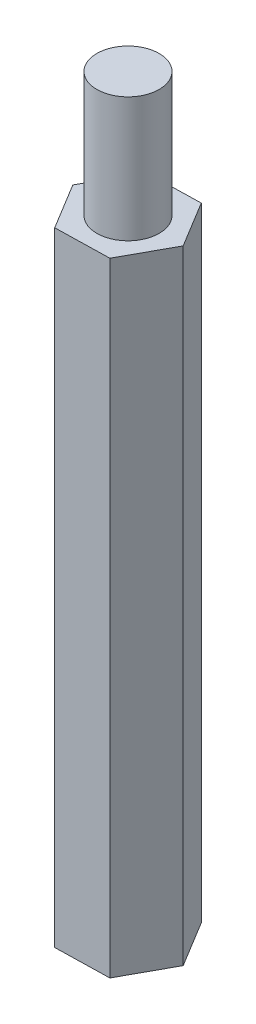
ISO-10303-21;
HEADER;
FILE_DESCRIPTION(('STEP AP214'),'2;1');
FILE_NAME('part.step','',(''),(''),'','','');
FILE_SCHEMA(('AUTOMOTIVE_DESIGN { 1 0 10303 214 1 1 1 1 }'));
ENDSEC;
DATA;
#1=APPLICATION_CONTEXT('core data for automotive mechanical design processes');
#2=APPLICATION_PROTOCOL_DEFINITION('international standard','automotive_design',2000,#1);
#3=PRODUCT_CONTEXT('',#1,'mechanical');
#4=PRODUCT('Part','Part','',(#3));
#5=PRODUCT_RELATED_PRODUCT_CATEGORY('part','',(#4));
#6=PRODUCT_DEFINITION_FORMATION('','',#4);
#7=PRODUCT_DEFINITION_CONTEXT('part definition',#1,'design');
#8=PRODUCT_DEFINITION('design','',#6,#7);
#9=PRODUCT_DEFINITION_SHAPE('','',#8);
#10=(LENGTH_UNIT() NAMED_UNIT(*) SI_UNIT(.MILLI.,.METRE.));
#11=(NAMED_UNIT(*) PLANE_ANGLE_UNIT() SI_UNIT($,.RADIAN.));
#12=(NAMED_UNIT(*) SI_UNIT($,.STERADIAN.) SOLID_ANGLE_UNIT());
#13=UNCERTAINTY_MEASURE_WITH_UNIT(LENGTH_MEASURE(1.E-05),#10,'distance_accuracy_value','');
#14=(GEOMETRIC_REPRESENTATION_CONTEXT(3) GLOBAL_UNCERTAINTY_ASSIGNED_CONTEXT((#13)) GLOBAL_UNIT_ASSIGNED_CONTEXT((#10,
#11,#12)) REPRESENTATION_CONTEXT('',''));
#15=CARTESIAN_POINT('',(0.,0.,0.));
#16=DIRECTION('',(0.,0.,1.));
#17=DIRECTION('',(1.,0.,0.));
#18=AXIS2_PLACEMENT_3D('',#15,#16,#17);
#19=CARTESIAN_POINT('',(0.,30.,0.));
#20=DIRECTION('',(0.,1.,0.));
#21=DIRECTION('',(0.,0.,1.));
#22=AXIS2_PLACEMENT_3D('',#19,#20,#21);
#23=PLANE('',#22);
#24=DIRECTION('',(-0.519215943218182,0.,-0.854643085918358));
#25=VECTOR('',#24,1.);
#26=CARTESIAN_POINT('',(2.59742823863157,30.,-0.0580219368798728));
#27=LINE('',#26,#25);
#28=CARTESIAN_POINT('',(2.59742823863157,30.,-0.0580219368798728));
#29=VERTEX_POINT('',#28);
#30=CARTESIAN_POINT('',(1.24846564800104,30.,-2.27844980760195));
#31=VERTEX_POINT('',#30);
#32=EDGE_CURVE('E134',#29,#31,#27,.T.);
#33=ORIENTED_EDGE('',*,*,#32,.T.);
#34=DIRECTION('',(-0.999750595183115,0.,0.0223326539176654));
#35=VECTOR('',#34,1.);
#36=CARTESIAN_POINT('',(1.24846564800104,30.,-2.27844980760195));
#37=LINE('',#36,#35);
#38=CARTESIAN_POINT('',(-1.34896259063053,30.,-2.22042787072207));
#39=VERTEX_POINT('',#38);
#40=EDGE_CURVE('E92',#31,#39,#37,.T.);
#41=ORIENTED_EDGE('',*,*,#40,.T.);
#42=DIRECTION('',(-0.480534651964933,0.,0.876975739836023));
#43=VECTOR('',#42,1.);
#44=CARTESIAN_POINT('',(-1.34896259063053,30.,-2.22042787072207));
#45=LINE('',#44,#43);
#46=CARTESIAN_POINT('',(-2.59742823863157,30.,0.058021936879873));
#47=VERTEX_POINT('',#46);
#48=EDGE_CURVE('E105',#39,#47,#45,.T.);
#49=ORIENTED_EDGE('',*,*,#48,.T.);
#50=DIRECTION('',(0.519215943218182,0.,0.854643085918358));
#51=VECTOR('',#50,1.);
#52=CARTESIAN_POINT('',(-2.59742823863157,30.,0.058021936879873));
#53=LINE('',#52,#51);
#54=CARTESIAN_POINT('',(-1.24846564800104,30.,2.27844980760195));
#55=VERTEX_POINT('',#54);
#56=EDGE_CURVE('E99',#47,#55,#53,.T.);
#57=ORIENTED_EDGE('',*,*,#56,.T.);
#58=DIRECTION('',(0.999750595183115,0.,-0.0223326539176651));
#59=VECTOR('',#58,1.);
#60=CARTESIAN_POINT('',(-1.24846564800104,30.,2.27844980760195));
#61=LINE('',#60,#59);
#62=CARTESIAN_POINT('',(1.34896259063053,30.,2.22042787072208));
#63=VERTEX_POINT('',#62);
#64=EDGE_CURVE('E103',#55,#63,#61,.T.);
#65=ORIENTED_EDGE('',*,*,#64,.T.);
#66=DIRECTION('',(0.480534651964934,0.,-0.876975739836023));
#67=VECTOR('',#66,1.);
#68=CARTESIAN_POINT('',(1.34896259063053,30.,2.22042787072208));
#69=LINE('',#68,#67);
#70=EDGE_CURVE('E55',#63,#29,#69,.T.);
#71=ORIENTED_EDGE('',*,*,#70,.T.);
#72=EDGE_LOOP('',(#33,#41,#49,#57,#65,#71));
#73=FACE_BOUND('',#72,.T.);
#74=CARTESIAN_POINT('',(0.,30.,0.));
#75=DIRECTION('',(0.,1.,0.));
#76=DIRECTION('',(0.,0.,1.));
#77=AXIS2_PLACEMENT_3D('',#74,#75,#76);
#78=CIRCLE('',#77,1.5);
#79=CARTESIAN_POINT('',(0.,30.,1.5));
#80=VERTEX_POINT('',#79);
#81=EDGE_CURVE('E127',#80,#80,#78,.T.);
#82=ORIENTED_EDGE('',*,*,#81,.F.);
#83=EDGE_LOOP('',(#82));
#84=FACE_BOUND('',#83,.T.);
#85=ADVANCED_FACE('F38',(#73,#84),#23,.T.);
#86=CARTESIAN_POINT('',(0.,0.,0.));
#87=DIRECTION('',(0.,1.,0.));
#88=DIRECTION('',(0.,0.,1.));
#89=AXIS2_PLACEMENT_3D('',#86,#87,#88);
#90=PLANE('',#89);
#91=CARTESIAN_POINT('',(0.,0.,0.));
#92=DIRECTION('',(0.,-1.,0.));
#93=DIRECTION('',(0.,0.,-1.));
#94=AXIS2_PLACEMENT_3D('',#91,#92,#93);
#95=CIRCLE('',#94,1.5);
#96=CARTESIAN_POINT('',(0.,0.,-1.5));
#97=VERTEX_POINT('',#96);
#98=EDGE_CURVE('E183',#97,#97,#95,.T.);
#99=ORIENTED_EDGE('',*,*,#98,.F.);
#100=EDGE_LOOP('',(#99));
#101=FACE_BOUND('',#100,.T.);
#102=DIRECTION('',(-0.519215943218182,0.,-0.854643085918358));
#103=VECTOR('',#102,1.);
#104=CARTESIAN_POINT('',(2.59742823863157,0.,-0.0580219368798728));
#105=LINE('',#104,#103);
#106=CARTESIAN_POINT('',(2.59742823863157,0.,-0.0580219368798728));
#107=VERTEX_POINT('',#106);
#108=CARTESIAN_POINT('',(1.24846564800104,0.,-2.27844980760195));
#109=VERTEX_POINT('',#108);
#110=EDGE_CURVE('E123',#107,#109,#105,.T.);
#111=ORIENTED_EDGE('',*,*,#110,.F.);
#112=DIRECTION('',(0.480534651964934,0.,-0.876975739836023));
#113=VECTOR('',#112,1.);
#114=CARTESIAN_POINT('',(1.34896259063053,0.,2.22042787072208));
#115=LINE('',#114,#113);
#116=CARTESIAN_POINT('',(1.34896259063053,0.,2.22042787072208));
#117=VERTEX_POINT('',#116);
#118=EDGE_CURVE('E84',#117,#107,#115,.T.);
#119=ORIENTED_EDGE('',*,*,#118,.F.);
#120=DIRECTION('',(0.999750595183115,0.,-0.0223326539176651));
#121=VECTOR('',#120,1.);
#122=CARTESIAN_POINT('',(-1.24846564800104,0.,2.27844980760195));
#123=LINE('',#122,#121);
#124=CARTESIAN_POINT('',(-1.24846564800104,0.,2.27844980760195));
#125=VERTEX_POINT('',#124);
#126=EDGE_CURVE('E78',#125,#117,#123,.T.);
#127=ORIENTED_EDGE('',*,*,#126,.F.);
#128=DIRECTION('',(0.519215943218182,0.,0.854643085918358));
#129=VECTOR('',#128,1.);
#130=CARTESIAN_POINT('',(-2.59742823863157,0.,0.058021936879873));
#131=LINE('',#130,#129);
#132=CARTESIAN_POINT('',(-2.59742823863157,0.,0.058021936879873));
#133=VERTEX_POINT('',#132);
#134=EDGE_CURVE('E113',#133,#125,#131,.T.);
#135=ORIENTED_EDGE('',*,*,#134,.F.);
#136=DIRECTION('',(-0.480534651964933,0.,0.876975739836023));
#137=VECTOR('',#136,1.);
#138=CARTESIAN_POINT('',(-1.34896259063053,0.,-2.22042787072207));
#139=LINE('',#138,#137);
#140=CARTESIAN_POINT('',(-1.34896259063053,0.,-2.22042787072207));
#141=VERTEX_POINT('',#140);
#142=EDGE_CURVE('E129',#141,#133,#139,.T.);
#143=ORIENTED_EDGE('',*,*,#142,.F.);
#144=DIRECTION('',(-0.999750595183115,0.,0.0223326539176654));
#145=VECTOR('',#144,1.);
#146=CARTESIAN_POINT('',(1.24846564800104,0.,-2.27844980760195));
#147=LINE('',#146,#145);
#148=EDGE_CURVE('E126',#109,#141,#147,.T.);
#149=ORIENTED_EDGE('',*,*,#148,.F.);
#150=EDGE_LOOP('',(#111,#119,#127,#135,#143,#149));
#151=FACE_BOUND('',#150,.T.);
#152=ADVANCED_FACE('F143',(#101,#151),#90,.F.);
#153=CARTESIAN_POINT('',(2.59742823863157,30.,-0.0580219368798728));
#154=DIRECTION('',(-0.854643085918358,0.,0.519215943218182));
#155=DIRECTION('',(0.519215943218182,0.,0.854643085918358));
#156=AXIS2_PLACEMENT_3D('',#153,#154,#155);
#157=PLANE('',#156);
#158=ORIENTED_EDGE('',*,*,#110,.T.);
#159=DIRECTION('',(0.,-1.,0.));
#160=VECTOR('',#159,1.);
#161=CARTESIAN_POINT('',(1.24846564800104,30.,-2.27844980760195));
#162=LINE('',#161,#160);
#163=EDGE_CURVE('E11',#31,#109,#162,.T.);
#164=ORIENTED_EDGE('',*,*,#163,.F.);
#165=ORIENTED_EDGE('',*,*,#32,.F.);
#166=DIRECTION('',(0.,-1.,0.));
#167=VECTOR('',#166,1.);
#168=CARTESIAN_POINT('',(2.59742823863157,30.,-0.0580219368798728));
#169=LINE('',#168,#167);
#170=EDGE_CURVE('E119',#29,#107,#169,.T.);
#171=ORIENTED_EDGE('',*,*,#170,.T.);
#172=EDGE_LOOP('',(#158,#164,#165,#171));
#173=FACE_BOUND('',#172,.T.);
#174=ADVANCED_FACE('F40',(#173),#157,.F.);
#175=CARTESIAN_POINT('',(1.24846564800104,30.,-2.27844980760195));
#176=DIRECTION('',(0.0223326539176654,0.,0.999750595183115));
#177=DIRECTION('',(0.999750595183116,0.,-0.0223326539176654));
#178=AXIS2_PLACEMENT_3D('',#175,#176,#177);
#179=PLANE('',#178);
#180=ORIENTED_EDGE('',*,*,#148,.T.);
#181=DIRECTION('',(0.,-1.,0.));
#182=VECTOR('',#181,1.);
#183=CARTESIAN_POINT('',(-1.34896259063053,30.,-2.22042787072207));
#184=LINE('',#183,#182);
#185=EDGE_CURVE('E47',#39,#141,#184,.T.);
#186=ORIENTED_EDGE('',*,*,#185,.F.);
#187=ORIENTED_EDGE('',*,*,#40,.F.);
#188=ORIENTED_EDGE('',*,*,#163,.T.);
#189=EDGE_LOOP('',(#180,#186,#187,#188));
#190=FACE_BOUND('',#189,.T.);
#191=ADVANCED_FACE('F241',(#190),#179,.F.);
#192=CARTESIAN_POINT('',(-1.34896259063053,30.,-2.22042787072207));
#193=DIRECTION('',(0.876975739836023,0.,0.480534651964933));
#194=DIRECTION('',(0.480534651964933,0.,-0.876975739836024));
#195=AXIS2_PLACEMENT_3D('',#192,#193,#194);
#196=PLANE('',#195);
#197=ORIENTED_EDGE('',*,*,#142,.T.);
#198=DIRECTION('',(0.,-1.,0.));
#199=VECTOR('',#198,1.);
#200=CARTESIAN_POINT('',(-2.59742823863157,30.,0.058021936879873));
#201=LINE('',#200,#199);
#202=EDGE_CURVE('E114',#47,#133,#201,.T.);
#203=ORIENTED_EDGE('',*,*,#202,.F.);
#204=ORIENTED_EDGE('',*,*,#48,.F.);
#205=ORIENTED_EDGE('',*,*,#185,.T.);
#206=EDGE_LOOP('',(#197,#203,#204,#205));
#207=FACE_BOUND('',#206,.T.);
#208=ADVANCED_FACE('F140',(#207),#196,.F.);
#209=CARTESIAN_POINT('',(-2.59742823863157,30.,0.058021936879873));
#210=DIRECTION('',(0.854643085918358,0.,-0.519215943218182));
#211=DIRECTION('',(-0.519215943218182,0.,-0.854643085918358));
#212=AXIS2_PLACEMENT_3D('',#209,#210,#211);
#213=PLANE('',#212);
#214=ORIENTED_EDGE('',*,*,#134,.T.);
#215=DIRECTION('',(0.,-1.,0.));
#216=VECTOR('',#215,1.);
#217=CARTESIAN_POINT('',(-1.24846564800104,30.,2.27844980760195));
#218=LINE('',#217,#216);
#219=EDGE_CURVE('E110',#55,#125,#218,.T.);
#220=ORIENTED_EDGE('',*,*,#219,.F.);
#221=ORIENTED_EDGE('',*,*,#56,.F.);
#222=ORIENTED_EDGE('',*,*,#202,.T.);
#223=EDGE_LOOP('',(#214,#220,#221,#222));
#224=FACE_BOUND('',#223,.T.);
#225=ADVANCED_FACE('F111',(#224),#213,.F.);
#226=CARTESIAN_POINT('',(-1.24846564800104,30.,2.27844980760195));
#227=DIRECTION('',(-0.0223326539176651,0.,-0.999750595183115));
#228=DIRECTION('',(-0.999750595183116,0.,0.0223326539176651));
#229=AXIS2_PLACEMENT_3D('',#226,#227,#228);
#230=PLANE('',#229);
#231=ORIENTED_EDGE('',*,*,#126,.T.);
#232=DIRECTION('',(0.,-1.,0.));
#233=VECTOR('',#232,1.);
#234=CARTESIAN_POINT('',(1.34896259063053,30.,2.22042787072208));
#235=LINE('',#234,#233);
#236=EDGE_CURVE('E115',#63,#117,#235,.T.);
#237=ORIENTED_EDGE('',*,*,#236,.F.);
#238=ORIENTED_EDGE('',*,*,#64,.F.);
#239=ORIENTED_EDGE('',*,*,#219,.T.);
#240=EDGE_LOOP('',(#231,#237,#238,#239));
#241=FACE_BOUND('',#240,.T.);
#242=ADVANCED_FACE('F117',(#241),#230,.F.);
#243=CARTESIAN_POINT('',(1.34896259063053,30.,2.22042787072208));
#244=DIRECTION('',(-0.876975739836023,0.,-0.480534651964934));
#245=DIRECTION('',(-0.480534651964934,0.,0.876975739836023));
#246=AXIS2_PLACEMENT_3D('',#243,#244,#245);
#247=PLANE('',#246);
#248=ORIENTED_EDGE('',*,*,#118,.T.);
#249=ORIENTED_EDGE('',*,*,#170,.F.);
#250=ORIENTED_EDGE('',*,*,#70,.F.);
#251=ORIENTED_EDGE('',*,*,#236,.T.);
#252=EDGE_LOOP('',(#248,#249,#250,#251));
#253=FACE_BOUND('',#252,.T.);
#254=ADVANCED_FACE('F147',(#253),#247,.F.);
#255=CARTESIAN_POINT('',(0.,36.,0.));
#256=DIRECTION('',(0.,-1.,0.));
#257=DIRECTION('',(0.,0.,-1.));
#258=AXIS2_PLACEMENT_3D('',#255,#256,#257);
#259=CYLINDRICAL_SURFACE('',#258,1.5);
#260=ORIENTED_EDGE('',*,*,#81,.T.);
#261=EDGE_LOOP('',(#260));
#262=FACE_BOUND('',#261,.T.);
#263=CARTESIAN_POINT('',(0.,36.,0.));
#264=DIRECTION('',(0.,1.,0.));
#265=DIRECTION('',(0.,0.,1.));
#266=AXIS2_PLACEMENT_3D('',#263,#264,#265);
#267=CIRCLE('',#266,1.5);
#268=CARTESIAN_POINT('',(0.,36.,1.5));
#269=VERTEX_POINT('',#268);
#270=EDGE_CURVE('E182',#269,#269,#267,.T.);
#271=ORIENTED_EDGE('',*,*,#270,.F.);
#272=EDGE_LOOP('',(#271));
#273=FACE_BOUND('',#272,.T.);
#274=ADVANCED_FACE('F149',(#262,#273),#259,.T.);
#275=CARTESIAN_POINT('',(0.,36.,0.));
#276=DIRECTION('',(0.,1.,0.));
#277=DIRECTION('',(0.,0.,1.));
#278=AXIS2_PLACEMENT_3D('',#275,#276,#277);
#279=PLANE('',#278);
#280=ORIENTED_EDGE('',*,*,#270,.T.);
#281=EDGE_LOOP('',(#280));
#282=FACE_BOUND('',#281,.T.);
#283=ADVANCED_FACE('F155',(#282),#279,.T.);
#284=CARTESIAN_POINT('',(0.,8.,0.));
#285=DIRECTION('',(0.,-1.,0.));
#286=DIRECTION('',(0.,0.,-1.));
#287=AXIS2_PLACEMENT_3D('',#284,#285,#286);
#288=CYLINDRICAL_SURFACE('',#287,1.5);
#289=CARTESIAN_POINT('',(0.,8.,0.));
#290=DIRECTION('',(0.,-1.,0.));
#291=DIRECTION('',(0.,0.,-1.));
#292=AXIS2_PLACEMENT_3D('',#289,#290,#291);
#293=CIRCLE('',#292,1.5);
#294=CARTESIAN_POINT('',(0.,8.,-1.5));
#295=VERTEX_POINT('',#294);
#296=EDGE_CURVE('E181',#295,#295,#293,.T.);
#297=ORIENTED_EDGE('',*,*,#296,.F.);
#298=EDGE_LOOP('',(#297));
#299=FACE_BOUND('',#298,.T.);
#300=ORIENTED_EDGE('',*,*,#98,.T.);
#301=EDGE_LOOP('',(#300));
#302=FACE_BOUND('',#301,.T.);
#303=ADVANCED_FACE('F169',(#299,#302),#288,.F.);
#304=CARTESIAN_POINT('',(0.,8.,0.));
#305=DIRECTION('',(0.,-1.,0.));
#306=DIRECTION('',(0.,0.,-1.));
#307=AXIS2_PLACEMENT_3D('',#304,#305,#306);
#308=PLANE('',#307);
#309=ORIENTED_EDGE('',*,*,#296,.T.);
#310=EDGE_LOOP('',(#309));
#311=FACE_BOUND('',#310,.T.);
#312=ADVANCED_FACE('F173',(#311),#308,.T.);
#313=CLOSED_SHELL('',(#85,#152,#174,#191,#208,#225,#242,#254,#274,#283,#303,#312));
#314=MANIFOLD_SOLID_BREP('B2',#313);
#315=ADVANCED_BREP_SHAPE_REPRESENTATION('',(#18,#314),#14);
#316=SHAPE_DEFINITION_REPRESENTATION(#9,#315);
ENDSEC;
END-ISO-10303-21;
